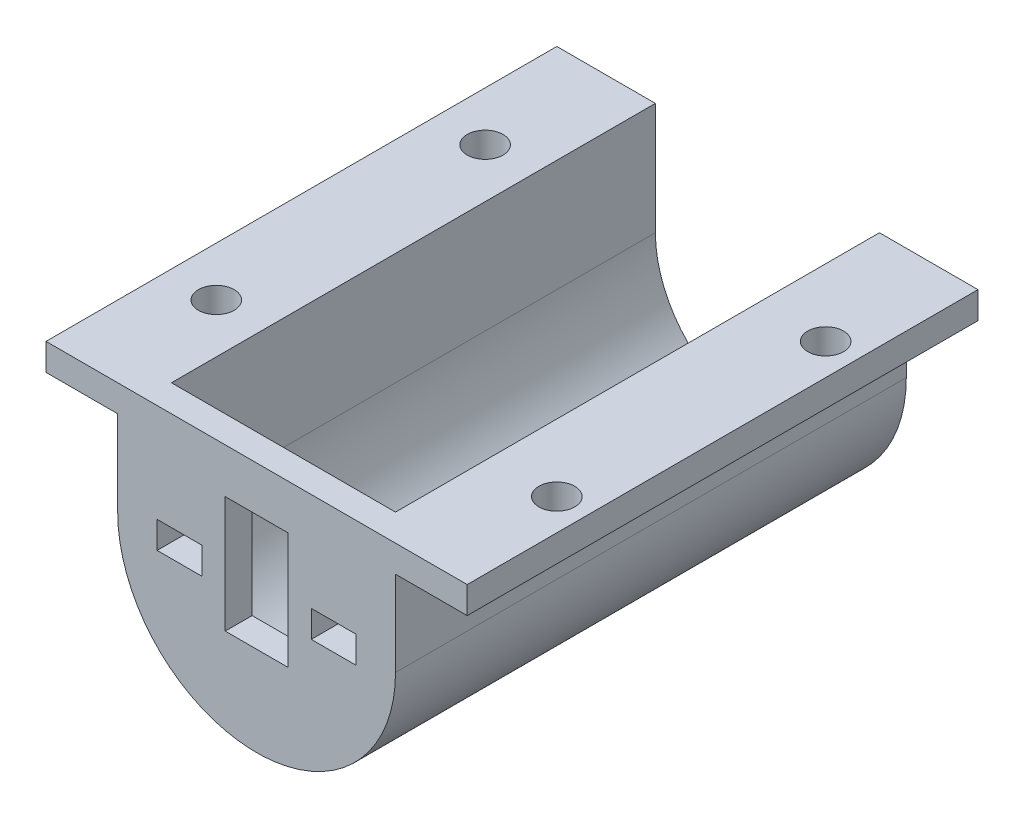
ISO-10303-21;
HEADER;
FILE_DESCRIPTION(('STEP AP214'),'2;1');
FILE_NAME('part.step','',(''),(''),'','','');
FILE_SCHEMA(('AUTOMOTIVE_DESIGN { 1 0 10303 214 1 1 1 1 }'));
ENDSEC;
DATA;
#1=APPLICATION_CONTEXT('core data for automotive mechanical design processes');
#2=APPLICATION_PROTOCOL_DEFINITION('international standard','automotive_design',2000,#1);
#3=PRODUCT_CONTEXT('',#1,'mechanical');
#4=PRODUCT('Part','Part','',(#3));
#5=PRODUCT_RELATED_PRODUCT_CATEGORY('part','',(#4));
#6=PRODUCT_DEFINITION_FORMATION('','',#4);
#7=PRODUCT_DEFINITION_CONTEXT('part definition',#1,'design');
#8=PRODUCT_DEFINITION('design','',#6,#7);
#9=PRODUCT_DEFINITION_SHAPE('','',#8);
#10=(LENGTH_UNIT() NAMED_UNIT(*) SI_UNIT(.MILLI.,.METRE.));
#11=(NAMED_UNIT(*) PLANE_ANGLE_UNIT() SI_UNIT($,.RADIAN.));
#12=(NAMED_UNIT(*) SI_UNIT($,.STERADIAN.) SOLID_ANGLE_UNIT());
#13=UNCERTAINTY_MEASURE_WITH_UNIT(LENGTH_MEASURE(1.E-05),#10,'distance_accuracy_value','');
#14=(GEOMETRIC_REPRESENTATION_CONTEXT(3) GLOBAL_UNCERTAINTY_ASSIGNED_CONTEXT((#13)) GLOBAL_UNIT_ASSIGNED_CONTEXT((#10,
#11,#12)) REPRESENTATION_CONTEXT('',''));
#15=CARTESIAN_POINT('',(0.,0.,0.));
#16=DIRECTION('',(0.,0.,1.));
#17=DIRECTION('',(1.,0.,0.));
#18=AXIS2_PLACEMENT_3D('',#15,#16,#17);
#19=CARTESIAN_POINT('',(0.,0.,28.5));
#20=DIRECTION('',(0.,0.,-1.));
#21=DIRECTION('',(-1.,0.,0.));
#22=AXIS2_PLACEMENT_3D('',#19,#20,#21);
#23=CYLINDRICAL_SURFACE('',#22,12.5);
#24=CARTESIAN_POINT('',(0.,0.,25.5));
#25=DIRECTION('',(0.,0.,1.));
#26=DIRECTION('',(1.,0.,0.));
#27=AXIS2_PLACEMENT_3D('',#24,#25,#26);
#28=CIRCLE('',#27,12.5);
#29=CARTESIAN_POINT('',(12.5,0.,25.5));
#30=VERTEX_POINT('',#29);
#31=CARTESIAN_POINT('',(-12.5,0.,25.5));
#32=VERTEX_POINT('',#31);
#33=EDGE_CURVE('E340',#30,#32,#28,.F.);
#34=ORIENTED_EDGE('',*,*,#33,.F.);
#35=DIRECTION('',(0.,0.,-1.));
#36=VECTOR('',#35,1.);
#37=CARTESIAN_POINT('',(12.5,0.,28.5));
#38=LINE('',#37,#36);
#39=CARTESIAN_POINT('',(12.5,0.,-28.5));
#40=VERTEX_POINT('',#39);
#41=EDGE_CURVE('E399',#30,#40,#38,.T.);
#42=ORIENTED_EDGE('',*,*,#41,.T.);
#43=CARTESIAN_POINT('',(0.,0.,-28.5));
#44=DIRECTION('',(0.,0.,-1.));
#45=DIRECTION('',(1.,0.,0.));
#46=AXIS2_PLACEMENT_3D('',#43,#44,#45);
#47=CIRCLE('',#46,12.5);
#48=CARTESIAN_POINT('',(-12.5,0.,-28.5));
#49=VERTEX_POINT('',#48);
#50=EDGE_CURVE('E372',#40,#49,#47,.T.);
#51=ORIENTED_EDGE('',*,*,#50,.T.);
#52=DIRECTION('',(0.,0.,-1.));
#53=VECTOR('',#52,1.);
#54=CARTESIAN_POINT('',(-12.5,0.,28.5));
#55=LINE('',#54,#53);
#56=EDGE_CURVE('E47',#32,#49,#55,.T.);
#57=ORIENTED_EDGE('',*,*,#56,.F.);
#58=EDGE_LOOP('',(#34,#42,#51,#57));
#59=FACE_BOUND('',#58,.T.);
#60=ADVANCED_FACE('F39',(#59),#23,.F.);
#61=CARTESIAN_POINT('',(-12.5,0.,28.5));
#62=DIRECTION('',(-1.,0.,0.));
#63=DIRECTION('',(0.,-1.,0.));
#64=AXIS2_PLACEMENT_3D('',#61,#62,#63);
#65=PLANE('',#64);
#66=DIRECTION('',(0.,1.,0.));
#67=VECTOR('',#66,1.);
#68=CARTESIAN_POINT('',(-12.5,0.,25.5));
#69=LINE('',#68,#67);
#70=CARTESIAN_POINT('',(-12.5,12.5,25.5));
#71=VERTEX_POINT('',#70);
#72=EDGE_CURVE('E343',#32,#71,#69,.T.);
#73=ORIENTED_EDGE('',*,*,#72,.F.);
#74=ORIENTED_EDGE('',*,*,#56,.T.);
#75=DIRECTION('',(0.,1.,0.));
#76=VECTOR('',#75,1.);
#77=CARTESIAN_POINT('',(-12.5,0.,-28.5));
#78=LINE('',#77,#76);
#79=CARTESIAN_POINT('',(-12.5,12.5,-28.5));
#80=VERTEX_POINT('',#79);
#81=EDGE_CURVE('E403',#49,#80,#78,.T.);
#82=ORIENTED_EDGE('',*,*,#81,.T.);
#83=DIRECTION('',(0.,0.,-1.));
#84=VECTOR('',#83,1.);
#85=CARTESIAN_POINT('',(-12.5,12.5,28.5));
#86=LINE('',#85,#84);
#87=EDGE_CURVE('E475',#71,#80,#86,.T.);
#88=ORIENTED_EDGE('',*,*,#87,.F.);
#89=EDGE_LOOP('',(#73,#74,#82,#88));
#90=FACE_BOUND('',#89,.T.);
#91=ADVANCED_FACE('F507',(#90),#65,.F.);
#92=CARTESIAN_POINT('',(12.5,0.,28.5));
#93=DIRECTION('',(1.,0.,0.));
#94=DIRECTION('',(0.,1.,0.));
#95=AXIS2_PLACEMENT_3D('',#92,#93,#94);
#96=PLANE('',#95);
#97=DIRECTION('',(0.,-1.,0.));
#98=VECTOR('',#97,1.);
#99=CARTESIAN_POINT('',(12.5,0.,25.5));
#100=LINE('',#99,#98);
#101=CARTESIAN_POINT('',(12.5,12.5,25.5));
#102=VERTEX_POINT('',#101);
#103=EDGE_CURVE('E11',#102,#30,#100,.T.);
#104=ORIENTED_EDGE('',*,*,#103,.F.);
#105=DIRECTION('',(0.,0.,-1.));
#106=VECTOR('',#105,1.);
#107=CARTESIAN_POINT('',(12.5,12.5,28.5));
#108=LINE('',#107,#106);
#109=CARTESIAN_POINT('',(12.5,12.5,-28.5));
#110=VERTEX_POINT('',#109);
#111=EDGE_CURVE('E444',#102,#110,#108,.T.);
#112=ORIENTED_EDGE('',*,*,#111,.T.);
#113=DIRECTION('',(0.,-1.,0.));
#114=VECTOR('',#113,1.);
#115=CARTESIAN_POINT('',(12.5,0.,-28.5));
#116=LINE('',#115,#114);
#117=EDGE_CURVE('E377',#110,#40,#116,.T.);
#118=ORIENTED_EDGE('',*,*,#117,.T.);
#119=ORIENTED_EDGE('',*,*,#41,.F.);
#120=EDGE_LOOP('',(#104,#112,#118,#119));
#121=FACE_BOUND('',#120,.T.);
#122=ADVANCED_FACE('F512',(#121),#96,.F.);
#123=CARTESIAN_POINT('',(-23.5,12.5,28.5));
#124=DIRECTION('',(1.,0.,0.));
#125=DIRECTION('',(0.,0.,-1.));
#126=AXIS2_PLACEMENT_3D('',#123,#124,#125);
#127=PLANE('',#126);
#128=DIRECTION('',(0.,-1.,0.));
#129=VECTOR('',#128,1.);
#130=CARTESIAN_POINT('',(-23.5,12.5,-28.5));
#131=LINE('',#130,#129);
#132=CARTESIAN_POINT('',(-23.5,12.5,-28.5));
#133=VERTEX_POINT('',#132);
#134=CARTESIAN_POINT('',(-23.5,9.5,-28.5));
#135=VERTEX_POINT('',#134);
#136=EDGE_CURVE('E410',#133,#135,#131,.T.);
#137=ORIENTED_EDGE('',*,*,#136,.T.);
#138=DIRECTION('',(0.,0.,-1.));
#139=VECTOR('',#138,1.);
#140=CARTESIAN_POINT('',(-23.5,9.5,28.5));
#141=LINE('',#140,#139);
#142=CARTESIAN_POINT('',(-23.5,9.5,28.5));
#143=VERTEX_POINT('',#142);
#144=EDGE_CURVE('E467',#143,#135,#141,.T.);
#145=ORIENTED_EDGE('',*,*,#144,.F.);
#146=DIRECTION('',(0.,-1.,0.));
#147=VECTOR('',#146,1.);
#148=CARTESIAN_POINT('',(-23.5,12.5,28.5));
#149=LINE('',#148,#147);
#150=CARTESIAN_POINT('',(-23.5,12.5,28.5));
#151=VERTEX_POINT('',#150);
#152=EDGE_CURVE('E376',#151,#143,#149,.T.);
#153=ORIENTED_EDGE('',*,*,#152,.F.);
#154=DIRECTION('',(0.,0.,-1.));
#155=VECTOR('',#154,1.);
#156=CARTESIAN_POINT('',(-23.5,12.5,28.5));
#157=LINE('',#156,#155);
#158=EDGE_CURVE('E471',#151,#133,#157,.T.);
#159=ORIENTED_EDGE('',*,*,#158,.T.);
#160=EDGE_LOOP('',(#137,#145,#153,#159));
#161=FACE_BOUND('',#160,.T.);
#162=ADVANCED_FACE('F563',(#161),#127,.F.);
#163=CARTESIAN_POINT('',(-23.5,9.5,28.5));
#164=DIRECTION('',(0.,1.,0.));
#165=DIRECTION('',(0.,0.,1.));
#166=AXIS2_PLACEMENT_3D('',#163,#164,#165);
#167=PLANE('',#166);
#168=CARTESIAN_POINT('',(-18.,9.50000000000001,-15.));
#169=DIRECTION('',(0.,-1.,0.));
#170=DIRECTION('',(1.,0.,0.));
#171=AXIS2_PLACEMENT_3D('',#168,#169,#170);
#172=CIRCLE('',#171,2.);
#173=CARTESIAN_POINT('',(-16.,9.50000000000001,-15.));
#174=VERTEX_POINT('',#173);
#175=EDGE_CURVE('E351',#174,#174,#172,.T.);
#176=ORIENTED_EDGE('',*,*,#175,.F.);
#177=EDGE_LOOP('',(#176));
#178=FACE_BOUND('',#177,.T.);
#179=CARTESIAN_POINT('',(-18.,9.50000000000001,15.));
#180=DIRECTION('',(0.,-1.,0.));
#181=DIRECTION('',(1.,0.,0.));
#182=AXIS2_PLACEMENT_3D('',#179,#180,#181);
#183=CIRCLE('',#182,2.);
#184=CARTESIAN_POINT('',(-16.,9.50000000000001,15.));
#185=VERTEX_POINT('',#184);
#186=EDGE_CURVE('E355',#185,#185,#183,.T.);
#187=ORIENTED_EDGE('',*,*,#186,.F.);
#188=EDGE_LOOP('',(#187));
#189=FACE_BOUND('',#188,.T.);
#190=DIRECTION('',(1.,0.,0.));
#191=VECTOR('',#190,1.);
#192=CARTESIAN_POINT('',(-23.5,9.5,-28.5));
#193=LINE('',#192,#191);
#194=CARTESIAN_POINT('',(-15.5,9.5,-28.5));
#195=VERTEX_POINT('',#194);
#196=EDGE_CURVE('E413',#135,#195,#193,.T.);
#197=ORIENTED_EDGE('',*,*,#196,.T.);
#198=DIRECTION('',(0.,0.,-1.));
#199=VECTOR('',#198,1.);
#200=CARTESIAN_POINT('',(-15.5,9.5,28.5));
#201=LINE('',#200,#199);
#202=CARTESIAN_POINT('',(-15.5,9.5,28.5));
#203=VERTEX_POINT('',#202);
#204=EDGE_CURVE('E464',#203,#195,#201,.T.);
#205=ORIENTED_EDGE('',*,*,#204,.F.);
#206=DIRECTION('',(1.,0.,0.));
#207=VECTOR('',#206,1.);
#208=CARTESIAN_POINT('',(-23.5,9.5,28.5));
#209=LINE('',#208,#207);
#210=EDGE_CURVE('E380',#143,#203,#209,.T.);
#211=ORIENTED_EDGE('',*,*,#210,.F.);
#212=ORIENTED_EDGE('',*,*,#144,.T.);
#213=EDGE_LOOP('',(#197,#205,#211,#212));
#214=FACE_BOUND('',#213,.T.);
#215=ADVANCED_FACE('F560',(#178,#189,#214),#167,.F.);
#216=CARTESIAN_POINT('',(-15.5,9.5,28.5));
#217=DIRECTION('',(1.,0.,0.));
#218=DIRECTION('',(0.,0.,-1.));
#219=AXIS2_PLACEMENT_3D('',#216,#217,#218);
#220=PLANE('',#219);
#221=ORIENTED_EDGE('',*,*,#204,.T.);
#222=DIRECTION('',(0.,-1.,0.));
#223=VECTOR('',#222,1.);
#224=CARTESIAN_POINT('',(-15.5,9.5,-28.5));
#225=LINE('',#224,#223);
#226=CARTESIAN_POINT('',(-15.5,0.,-28.5));
#227=VERTEX_POINT('',#226);
#228=EDGE_CURVE('E417',#195,#227,#225,.T.);
#229=ORIENTED_EDGE('',*,*,#228,.T.);
#230=DIRECTION('',(0.,0.,-1.));
#231=VECTOR('',#230,1.);
#232=CARTESIAN_POINT('',(-15.5,0.,28.5));
#233=LINE('',#232,#231);
#234=CARTESIAN_POINT('',(-15.5,0.,28.5));
#235=VERTEX_POINT('',#234);
#236=EDGE_CURVE('E461',#235,#227,#233,.T.);
#237=ORIENTED_EDGE('',*,*,#236,.F.);
#238=DIRECTION('',(0.,-1.,0.));
#239=VECTOR('',#238,1.);
#240=CARTESIAN_POINT('',(-15.5,9.5,28.5));
#241=LINE('',#240,#239);
#242=EDGE_CURVE('E383',#203,#235,#241,.T.);
#243=ORIENTED_EDGE('',*,*,#242,.F.);
#244=EDGE_LOOP('',(#221,#229,#237,#243));
#245=FACE_BOUND('',#244,.T.);
#246=ADVANCED_FACE('F556',(#245),#220,.F.);
#247=CARTESIAN_POINT('',(0.,0.,28.5));
#248=DIRECTION('',(0.,0.,-1.));
#249=DIRECTION('',(-1.,0.,0.));
#250=AXIS2_PLACEMENT_3D('',#247,#248,#249);
#251=CYLINDRICAL_SURFACE('',#250,15.5);
#252=ORIENTED_EDGE('',*,*,#236,.T.);
#253=CARTESIAN_POINT('',(0.,0.,-28.5));
#254=DIRECTION('',(0.,0.,1.));
#255=DIRECTION('',(1.,0.,0.));
#256=AXIS2_PLACEMENT_3D('',#253,#254,#255);
#257=CIRCLE('',#256,15.5);
#258=CARTESIAN_POINT('',(15.5,0.,-28.5));
#259=VERTEX_POINT('',#258);
#260=EDGE_CURVE('E421',#227,#259,#257,.T.);
#261=ORIENTED_EDGE('',*,*,#260,.T.);
#262=DIRECTION('',(0.,0.,-1.));
#263=VECTOR('',#262,1.);
#264=CARTESIAN_POINT('',(15.5,0.,28.5));
#265=LINE('',#264,#263);
#266=CARTESIAN_POINT('',(15.5,0.,28.5));
#267=VERTEX_POINT('',#266);
#268=EDGE_CURVE('E458',#267,#259,#265,.T.);
#269=ORIENTED_EDGE('',*,*,#268,.F.);
#270=CARTESIAN_POINT('',(0.,0.,28.5));
#271=DIRECTION('',(0.,0.,1.));
#272=DIRECTION('',(1.,0.,0.));
#273=AXIS2_PLACEMENT_3D('',#270,#271,#272);
#274=CIRCLE('',#273,15.5);
#275=EDGE_CURVE('E386',#235,#267,#274,.T.);
#276=ORIENTED_EDGE('',*,*,#275,.F.);
#277=EDGE_LOOP('',(#252,#261,#269,#276));
#278=FACE_BOUND('',#277,.T.);
#279=ADVANCED_FACE('F551',(#278),#251,.T.);
#280=CARTESIAN_POINT('',(15.5,9.5,28.5));
#281=DIRECTION('',(-1.,0.,0.));
#282=DIRECTION('',(0.,-1.,0.));
#283=AXIS2_PLACEMENT_3D('',#280,#281,#282);
#284=PLANE('',#283);
#285=ORIENTED_EDGE('',*,*,#268,.T.);
#286=DIRECTION('',(0.,1.,0.));
#287=VECTOR('',#286,1.);
#288=CARTESIAN_POINT('',(15.5,9.5,-28.5));
#289=LINE('',#288,#287);
#290=CARTESIAN_POINT('',(15.5,9.5,-28.5));
#291=VERTEX_POINT('',#290);
#292=EDGE_CURVE('E425',#259,#291,#289,.T.);
#293=ORIENTED_EDGE('',*,*,#292,.T.);
#294=DIRECTION('',(0.,0.,-1.));
#295=VECTOR('',#294,1.);
#296=CARTESIAN_POINT('',(15.5,9.5,28.5));
#297=LINE('',#296,#295);
#298=CARTESIAN_POINT('',(15.5,9.5,28.5));
#299=VERTEX_POINT('',#298);
#300=EDGE_CURVE('E455',#299,#291,#297,.T.);
#301=ORIENTED_EDGE('',*,*,#300,.F.);
#302=DIRECTION('',(0.,1.,0.));
#303=VECTOR('',#302,1.);
#304=CARTESIAN_POINT('',(15.5,9.5,28.5));
#305=LINE('',#304,#303);
#306=EDGE_CURVE('E389',#267,#299,#305,.T.);
#307=ORIENTED_EDGE('',*,*,#306,.F.);
#308=EDGE_LOOP('',(#285,#293,#301,#307));
#309=FACE_BOUND('',#308,.T.);
#310=ADVANCED_FACE('F545',(#309),#284,.F.);
#311=CARTESIAN_POINT('',(23.5,9.5,28.5));
#312=DIRECTION('',(0.,1.,0.));
#313=DIRECTION('',(-1.,0.,0.));
#314=AXIS2_PLACEMENT_3D('',#311,#312,#313);
#315=PLANE('',#314);
#316=CARTESIAN_POINT('',(20.,9.50000000000002,15.));
#317=DIRECTION('',(0.,-1.,0.));
#318=DIRECTION('',(1.,0.,0.));
#319=AXIS2_PLACEMENT_3D('',#316,#317,#318);
#320=CIRCLE('',#319,2.);
#321=CARTESIAN_POINT('',(22.,9.50000000000002,15.));
#322=VERTEX_POINT('',#321);
#323=EDGE_CURVE('E350',#322,#322,#320,.T.);
#324=ORIENTED_EDGE('',*,*,#323,.F.);
#325=EDGE_LOOP('',(#324));
#326=FACE_BOUND('',#325,.T.);
#327=CARTESIAN_POINT('',(20.,9.50000000000002,-15.));
#328=DIRECTION('',(0.,-1.,0.));
#329=DIRECTION('',(1.,0.,0.));
#330=AXIS2_PLACEMENT_3D('',#327,#328,#329);
#331=CIRCLE('',#330,2.);
#332=CARTESIAN_POINT('',(22.,9.50000000000002,-15.));
#333=VERTEX_POINT('',#332);
#334=EDGE_CURVE('E346',#333,#333,#331,.T.);
#335=ORIENTED_EDGE('',*,*,#334,.F.);
#336=EDGE_LOOP('',(#335));
#337=FACE_BOUND('',#336,.T.);
#338=DIRECTION('',(1.,0.,0.));
#339=VECTOR('',#338,1.);
#340=CARTESIAN_POINT('',(23.5,9.5,-28.5));
#341=LINE('',#340,#339);
#342=CARTESIAN_POINT('',(23.5,9.5,-28.5));
#343=VERTEX_POINT('',#342);
#344=EDGE_CURVE('E429',#291,#343,#341,.T.);
#345=ORIENTED_EDGE('',*,*,#344,.T.);
#346=DIRECTION('',(0.,0.,-1.));
#347=VECTOR('',#346,1.);
#348=CARTESIAN_POINT('',(23.5,9.5,28.5));
#349=LINE('',#348,#347);
#350=CARTESIAN_POINT('',(23.5,9.5,28.5));
#351=VERTEX_POINT('',#350);
#352=EDGE_CURVE('E451',#351,#343,#349,.T.);
#353=ORIENTED_EDGE('',*,*,#352,.F.);
#354=DIRECTION('',(1.,0.,0.));
#355=VECTOR('',#354,1.);
#356=CARTESIAN_POINT('',(23.5,9.5,28.5));
#357=LINE('',#356,#355);
#358=EDGE_CURVE('E392',#299,#351,#357,.T.);
#359=ORIENTED_EDGE('',*,*,#358,.F.);
#360=ORIENTED_EDGE('',*,*,#300,.T.);
#361=EDGE_LOOP('',(#345,#353,#359,#360));
#362=FACE_BOUND('',#361,.T.);
#363=ADVANCED_FACE('F541',(#326,#337,#362),#315,.F.);
#364=CARTESIAN_POINT('',(23.5,12.5,28.5));
#365=DIRECTION('',(-1.,0.,0.));
#366=DIRECTION('',(0.,0.,1.));
#367=AXIS2_PLACEMENT_3D('',#364,#365,#366);
#368=PLANE('',#367);
#369=DIRECTION('',(0.,1.,0.));
#370=VECTOR('',#369,1.);
#371=CARTESIAN_POINT('',(23.5,12.5,-28.5));
#372=LINE('',#371,#370);
#373=CARTESIAN_POINT('',(23.5,12.5,-28.5));
#374=VERTEX_POINT('',#373);
#375=EDGE_CURVE('E432',#343,#374,#372,.T.);
#376=ORIENTED_EDGE('',*,*,#375,.T.);
#377=DIRECTION('',(0.,0.,-1.));
#378=VECTOR('',#377,1.);
#379=CARTESIAN_POINT('',(23.5,12.5,28.5));
#380=LINE('',#379,#378);
#381=CARTESIAN_POINT('',(23.5,12.5,28.5));
#382=VERTEX_POINT('',#381);
#383=EDGE_CURVE('E447',#382,#374,#380,.T.);
#384=ORIENTED_EDGE('',*,*,#383,.F.);
#385=DIRECTION('',(0.,1.,0.));
#386=VECTOR('',#385,1.);
#387=CARTESIAN_POINT('',(23.5,12.5,28.5));
#388=LINE('',#387,#386);
#389=EDGE_CURVE('E395',#351,#382,#388,.T.);
#390=ORIENTED_EDGE('',*,*,#389,.F.);
#391=ORIENTED_EDGE('',*,*,#352,.T.);
#392=EDGE_LOOP('',(#376,#384,#390,#391));
#393=FACE_BOUND('',#392,.T.);
#394=ADVANCED_FACE('F536',(#393),#368,.F.);
#395=CARTESIAN_POINT('',(12.5,12.5,28.5));
#396=DIRECTION('',(0.,-1.,0.));
#397=DIRECTION('',(0.,0.,-1.));
#398=AXIS2_PLACEMENT_3D('',#395,#396,#397);
#399=PLANE('',#398);
#400=DIRECTION('',(-1.,0.,0.));
#401=VECTOR('',#400,1.);
#402=CARTESIAN_POINT('',(-12.5,12.5,28.5));
#403=LINE('',#402,#401);
#404=EDGE_CURVE('E373',#382,#151,#403,.T.);
#405=ORIENTED_EDGE('',*,*,#404,.F.);
#406=ORIENTED_EDGE('',*,*,#383,.T.);
#407=DIRECTION('',(-1.,0.,0.));
#408=VECTOR('',#407,1.);
#409=CARTESIAN_POINT('',(12.5,12.5,-28.5));
#410=LINE('',#409,#408);
#411=EDGE_CURVE('E435',#374,#110,#410,.T.);
#412=ORIENTED_EDGE('',*,*,#411,.T.);
#413=ORIENTED_EDGE('',*,*,#111,.F.);
#414=DIRECTION('',(-1.,0.,0.));
#415=VECTOR('',#414,1.);
#416=CARTESIAN_POINT('',(-15.5,12.5,25.5));
#417=LINE('',#416,#415);
#418=EDGE_CURVE('E246',#102,#71,#417,.T.);
#419=ORIENTED_EDGE('',*,*,#418,.T.);
#420=ORIENTED_EDGE('',*,*,#87,.T.);
#421=DIRECTION('',(-1.,0.,0.));
#422=VECTOR('',#421,1.);
#423=CARTESIAN_POINT('',(-12.5,12.5,-28.5));
#424=LINE('',#423,#422);
#425=EDGE_CURVE('E407',#80,#133,#424,.T.);
#426=ORIENTED_EDGE('',*,*,#425,.T.);
#427=ORIENTED_EDGE('',*,*,#158,.F.);
#428=EDGE_LOOP('',(#405,#406,#412,#413,#419,#420,#426,#427));
#429=FACE_BOUND('',#428,.T.);
#430=CARTESIAN_POINT('',(20.,12.5,15.));
#431=DIRECTION('',(0.,-1.,0.));
#432=DIRECTION('',(0.,0.,-1.));
#433=AXIS2_PLACEMENT_3D('',#430,#431,#432);
#434=CIRCLE('',#433,2.);
#435=CARTESIAN_POINT('',(20.,12.5,13.));
#436=VERTEX_POINT('',#435);
#437=EDGE_CURVE('E368',#436,#436,#434,.T.);
#438=ORIENTED_EDGE('',*,*,#437,.T.);
#439=EDGE_LOOP('',(#438));
#440=FACE_BOUND('',#439,.T.);
#441=CARTESIAN_POINT('',(20.,12.5,-15.));
#442=DIRECTION('',(0.,-1.,0.));
#443=DIRECTION('',(0.,0.,-1.));
#444=AXIS2_PLACEMENT_3D('',#441,#442,#443);
#445=CIRCLE('',#444,2.);
#446=CARTESIAN_POINT('',(20.,12.5,-17.));
#447=VERTEX_POINT('',#446);
#448=EDGE_CURVE('E362',#447,#447,#445,.T.);
#449=ORIENTED_EDGE('',*,*,#448,.T.);
#450=EDGE_LOOP('',(#449));
#451=FACE_BOUND('',#450,.T.);
#452=CARTESIAN_POINT('',(-18.,12.5,-15.));
#453=DIRECTION('',(0.,-1.,0.));
#454=DIRECTION('',(1.,0.,0.));
#455=AXIS2_PLACEMENT_3D('',#452,#453,#454);
#456=CIRCLE('',#455,2.);
#457=CARTESIAN_POINT('',(-16.,12.5,-15.));
#458=VERTEX_POINT('',#457);
#459=EDGE_CURVE('E367',#458,#458,#456,.T.);
#460=ORIENTED_EDGE('',*,*,#459,.T.);
#461=EDGE_LOOP('',(#460));
#462=FACE_BOUND('',#461,.T.);
#463=CARTESIAN_POINT('',(-18.,12.5,15.));
#464=DIRECTION('',(0.,-1.,0.));
#465=DIRECTION('',(1.,0.,0.));
#466=AXIS2_PLACEMENT_3D('',#463,#464,#465);
#467=CIRCLE('',#466,2.);
#468=CARTESIAN_POINT('',(-16.,12.5,15.));
#469=VERTEX_POINT('',#468);
#470=EDGE_CURVE('E363',#469,#469,#467,.T.);
#471=ORIENTED_EDGE('',*,*,#470,.T.);
#472=EDGE_LOOP('',(#471));
#473=FACE_BOUND('',#472,.T.);
#474=ADVANCED_FACE('F486',(#429,#440,#451,#462,#473),#399,.F.);
#475=CARTESIAN_POINT('',(0.,0.,28.5));
#476=DIRECTION('',(0.,0.,1.));
#477=DIRECTION('',(1.,0.,0.));
#478=AXIS2_PLACEMENT_3D('',#475,#476,#477);
#479=PLANE('',#478);
#480=DIRECTION('',(0.,1.,0.));
#481=VECTOR('',#480,1.);
#482=CARTESIAN_POINT('',(11.1,1.5,28.5));
#483=LINE('',#482,#481);
#484=CARTESIAN_POINT('',(11.1,-1.5,28.5));
#485=VERTEX_POINT('',#484);
#486=CARTESIAN_POINT('',(11.1,1.5,28.5));
#487=VERTEX_POINT('',#486);
#488=EDGE_CURVE('E54',#485,#487,#483,.T.);
#489=ORIENTED_EDGE('',*,*,#488,.F.);
#490=DIRECTION('',(1.,0.,0.));
#491=VECTOR('',#490,1.);
#492=CARTESIAN_POINT('',(11.1,-1.5,28.5));
#493=LINE('',#492,#491);
#494=CARTESIAN_POINT('',(6.1,-1.5,28.5));
#495=VERTEX_POINT('',#494);
#496=EDGE_CURVE('E223',#495,#485,#493,.T.);
#497=ORIENTED_EDGE('',*,*,#496,.F.);
#498=DIRECTION('',(0.,-1.,0.));
#499=VECTOR('',#498,1.);
#500=CARTESIAN_POINT('',(6.1,1.5,28.5));
#501=LINE('',#500,#499);
#502=CARTESIAN_POINT('',(6.1,1.5,28.5));
#503=VERTEX_POINT('',#502);
#504=EDGE_CURVE('E227',#503,#495,#501,.T.);
#505=ORIENTED_EDGE('',*,*,#504,.F.);
#506=DIRECTION('',(-1.,0.,0.));
#507=VECTOR('',#506,1.);
#508=CARTESIAN_POINT('',(11.1,1.5,28.5));
#509=LINE('',#508,#507);
#510=EDGE_CURVE('E236',#487,#503,#509,.T.);
#511=ORIENTED_EDGE('',*,*,#510,.F.);
#512=EDGE_LOOP('',(#489,#497,#505,#511));
#513=FACE_BOUND('',#512,.T.);
#514=DIRECTION('',(0.,-1.,0.));
#515=VECTOR('',#514,1.);
#516=CARTESIAN_POINT('',(-11.1,1.5,28.5));
#517=LINE('',#516,#515);
#518=CARTESIAN_POINT('',(-11.1,1.5,28.5));
#519=VERTEX_POINT('',#518);
#520=CARTESIAN_POINT('',(-11.1,-1.5,28.5));
#521=VERTEX_POINT('',#520);
#522=EDGE_CURVE('E62',#519,#521,#517,.T.);
#523=ORIENTED_EDGE('',*,*,#522,.F.);
#524=DIRECTION('',(-1.,0.,0.));
#525=VECTOR('',#524,1.);
#526=CARTESIAN_POINT('',(-11.1,1.5,28.5));
#527=LINE('',#526,#525);
#528=CARTESIAN_POINT('',(-6.1,1.5,28.5));
#529=VERTEX_POINT('',#528);
#530=EDGE_CURVE('E257',#529,#519,#527,.T.);
#531=ORIENTED_EDGE('',*,*,#530,.F.);
#532=DIRECTION('',(0.,1.,0.));
#533=VECTOR('',#532,1.);
#534=CARTESIAN_POINT('',(-6.1,1.5,28.5));
#535=LINE('',#534,#533);
#536=CARTESIAN_POINT('',(-6.1,-1.5,28.5));
#537=VERTEX_POINT('',#536);
#538=EDGE_CURVE('E277',#537,#529,#535,.T.);
#539=ORIENTED_EDGE('',*,*,#538,.F.);
#540=DIRECTION('',(1.,0.,0.));
#541=VECTOR('',#540,1.);
#542=CARTESIAN_POINT('',(-11.1,-1.5,28.5));
#543=LINE('',#542,#541);
#544=EDGE_CURVE('E272',#521,#537,#543,.T.);
#545=ORIENTED_EDGE('',*,*,#544,.F.);
#546=EDGE_LOOP('',(#523,#531,#539,#545));
#547=FACE_BOUND('',#546,.T.);
#548=DIRECTION('',(0.,-1.,0.));
#549=VECTOR('',#548,1.);
#550=CARTESIAN_POINT('',(-3.5,-5.5,28.5));
#551=LINE('',#550,#549);
#552=CARTESIAN_POINT('',(-3.5,7.5,28.5));
#553=VERTEX_POINT('',#552);
#554=CARTESIAN_POINT('',(-3.5,-5.5,28.5));
#555=VERTEX_POINT('',#554);
#556=EDGE_CURVE('E312',#553,#555,#551,.T.);
#557=ORIENTED_EDGE('',*,*,#556,.F.);
#558=DIRECTION('',(-1.,0.,0.));
#559=VECTOR('',#558,1.);
#560=CARTESIAN_POINT('',(-3.5,7.5,28.5));
#561=LINE('',#560,#559);
#562=CARTESIAN_POINT('',(3.5,7.5,28.5));
#563=VERTEX_POINT('',#562);
#564=EDGE_CURVE('E299',#563,#553,#561,.T.);
#565=ORIENTED_EDGE('',*,*,#564,.F.);
#566=DIRECTION('',(0.,1.,0.));
#567=VECTOR('',#566,1.);
#568=CARTESIAN_POINT('',(3.5,-5.5,28.5));
#569=LINE('',#568,#567);
#570=CARTESIAN_POINT('',(3.5,-5.5,28.5));
#571=VERTEX_POINT('',#570);
#572=EDGE_CURVE('E319',#571,#563,#569,.T.);
#573=ORIENTED_EDGE('',*,*,#572,.F.);
#574=DIRECTION('',(1.,0.,0.));
#575=VECTOR('',#574,1.);
#576=CARTESIAN_POINT('',(3.5,-5.5,28.5));
#577=LINE('',#576,#575);
#578=EDGE_CURVE('E315',#555,#571,#577,.T.);
#579=ORIENTED_EDGE('',*,*,#578,.F.);
#580=EDGE_LOOP('',(#557,#565,#573,#579));
#581=FACE_BOUND('',#580,.T.);
#582=ORIENTED_EDGE('',*,*,#389,.T.);
#583=ORIENTED_EDGE('',*,*,#404,.T.);
#584=ORIENTED_EDGE('',*,*,#152,.T.);
#585=ORIENTED_EDGE('',*,*,#210,.T.);
#586=ORIENTED_EDGE('',*,*,#242,.T.);
#587=ORIENTED_EDGE('',*,*,#275,.T.);
#588=ORIENTED_EDGE('',*,*,#306,.T.);
#589=ORIENTED_EDGE('',*,*,#358,.T.);
#590=EDGE_LOOP('',(#582,#583,#584,#585,#586,#587,#588,#589));
#591=FACE_BOUND('',#590,.T.);
#592=ADVANCED_FACE('F567',(#513,#547,#581,#591),#479,.T.);
#593=CARTESIAN_POINT('',(0.,0.,-28.5));
#594=DIRECTION('',(0.,0.,1.));
#595=DIRECTION('',(1.,0.,0.));
#596=AXIS2_PLACEMENT_3D('',#593,#594,#595);
#597=PLANE('',#596);
#598=ORIENTED_EDGE('',*,*,#50,.F.);
#599=ORIENTED_EDGE('',*,*,#117,.F.);
#600=ORIENTED_EDGE('',*,*,#411,.F.);
#601=ORIENTED_EDGE('',*,*,#375,.F.);
#602=ORIENTED_EDGE('',*,*,#344,.F.);
#603=ORIENTED_EDGE('',*,*,#292,.F.);
#604=ORIENTED_EDGE('',*,*,#260,.F.);
#605=ORIENTED_EDGE('',*,*,#228,.F.);
#606=ORIENTED_EDGE('',*,*,#196,.F.);
#607=ORIENTED_EDGE('',*,*,#136,.F.);
#608=ORIENTED_EDGE('',*,*,#425,.F.);
#609=ORIENTED_EDGE('',*,*,#81,.F.);
#610=EDGE_LOOP('',(#598,#599,#600,#601,#602,#603,#604,#605,#606,#607,#608,#609));
#611=FACE_BOUND('',#610,.T.);
#612=ADVANCED_FACE('F502',(#611),#597,.F.);
#613=CARTESIAN_POINT('',(20.,14.5,-15.));
#614=DIRECTION('',(0.,-1.,0.));
#615=DIRECTION('',(1.,0.,0.));
#616=AXIS2_PLACEMENT_3D('',#613,#614,#615);
#617=CYLINDRICAL_SURFACE('',#616,2.);
#618=ORIENTED_EDGE('',*,*,#334,.T.);
#619=EDGE_LOOP('',(#618));
#620=FACE_BOUND('',#619,.T.);
#621=ORIENTED_EDGE('',*,*,#448,.F.);
#622=EDGE_LOOP('',(#621));
#623=FACE_BOUND('',#622,.T.);
#624=ADVANCED_FACE('F492',(#620,#623),#617,.F.);
#625=CARTESIAN_POINT('',(20.,14.5,15.));
#626=DIRECTION('',(0.,-1.,0.));
#627=DIRECTION('',(1.,0.,0.));
#628=AXIS2_PLACEMENT_3D('',#625,#626,#627);
#629=CYLINDRICAL_SURFACE('',#628,2.);
#630=ORIENTED_EDGE('',*,*,#323,.T.);
#631=EDGE_LOOP('',(#630));
#632=FACE_BOUND('',#631,.T.);
#633=ORIENTED_EDGE('',*,*,#437,.F.);
#634=EDGE_LOOP('',(#633));
#635=FACE_BOUND('',#634,.T.);
#636=ADVANCED_FACE('F489',(#632,#635),#629,.F.);
#637=CARTESIAN_POINT('',(-18.,14.5,15.));
#638=DIRECTION('',(0.,-1.,0.));
#639=DIRECTION('',(1.,0.,0.));
#640=AXIS2_PLACEMENT_3D('',#637,#638,#639);
#641=CYLINDRICAL_SURFACE('',#640,2.);
#642=ORIENTED_EDGE('',*,*,#186,.T.);
#643=EDGE_LOOP('',(#642));
#644=FACE_BOUND('',#643,.T.);
#645=ORIENTED_EDGE('',*,*,#470,.F.);
#646=EDGE_LOOP('',(#645));
#647=FACE_BOUND('',#646,.T.);
#648=ADVANCED_FACE('F491',(#644,#647),#641,.F.);
#649=CARTESIAN_POINT('',(-18.,14.5,-15.));
#650=DIRECTION('',(0.,-1.,0.));
#651=DIRECTION('',(1.,0.,0.));
#652=AXIS2_PLACEMENT_3D('',#649,#650,#651);
#653=CYLINDRICAL_SURFACE('',#652,2.);
#654=ORIENTED_EDGE('',*,*,#175,.T.);
#655=EDGE_LOOP('',(#654));
#656=FACE_BOUND('',#655,.T.);
#657=ORIENTED_EDGE('',*,*,#459,.F.);
#658=EDGE_LOOP('',(#657));
#659=FACE_BOUND('',#658,.T.);
#660=ADVANCED_FACE('F499',(#656,#659),#653,.F.);
#661=CARTESIAN_POINT('',(0.,0.,25.5));
#662=DIRECTION('',(0.,0.,1.));
#663=DIRECTION('',(1.,0.,0.));
#664=AXIS2_PLACEMENT_3D('',#661,#662,#663);
#665=PLANE('',#664);
#666=DIRECTION('',(1.,0.,0.));
#667=VECTOR('',#666,1.);
#668=CARTESIAN_POINT('',(11.1,-1.5,25.5));
#669=LINE('',#668,#667);
#670=CARTESIAN_POINT('',(6.1,-1.5,25.5));
#671=VERTEX_POINT('',#670);
#672=CARTESIAN_POINT('',(11.1,-1.5,25.5));
#673=VERTEX_POINT('',#672);
#674=EDGE_CURVE('E208',#671,#673,#669,.T.);
#675=ORIENTED_EDGE('',*,*,#674,.T.);
#676=DIRECTION('',(0.,1.,0.));
#677=VECTOR('',#676,1.);
#678=CARTESIAN_POINT('',(11.1,1.5,25.5));
#679=LINE('',#678,#677);
#680=CARTESIAN_POINT('',(11.1,1.5,25.5));
#681=VERTEX_POINT('',#680);
#682=EDGE_CURVE('E201',#673,#681,#679,.T.);
#683=ORIENTED_EDGE('',*,*,#682,.T.);
#684=DIRECTION('',(-1.,0.,0.));
#685=VECTOR('',#684,1.);
#686=CARTESIAN_POINT('',(11.1,1.5,25.5));
#687=LINE('',#686,#685);
#688=CARTESIAN_POINT('',(6.1,1.5,25.5));
#689=VERTEX_POINT('',#688);
#690=EDGE_CURVE('E212',#681,#689,#687,.T.);
#691=ORIENTED_EDGE('',*,*,#690,.T.);
#692=DIRECTION('',(0.,-1.,0.));
#693=VECTOR('',#692,1.);
#694=CARTESIAN_POINT('',(6.1,1.5,25.5));
#695=LINE('',#694,#693);
#696=EDGE_CURVE('E217',#689,#671,#695,.T.);
#697=ORIENTED_EDGE('',*,*,#696,.T.);
#698=EDGE_LOOP('',(#675,#683,#691,#697));
#699=FACE_BOUND('',#698,.T.);
#700=DIRECTION('',(-1.,0.,0.));
#701=VECTOR('',#700,1.);
#702=CARTESIAN_POINT('',(-11.1,1.5,25.5));
#703=LINE('',#702,#701);
#704=CARTESIAN_POINT('',(-6.1,1.5,25.5));
#705=VERTEX_POINT('',#704);
#706=CARTESIAN_POINT('',(-11.1,1.5,25.5));
#707=VERTEX_POINT('',#706);
#708=EDGE_CURVE('E265',#705,#707,#703,.T.);
#709=ORIENTED_EDGE('',*,*,#708,.T.);
#710=DIRECTION('',(0.,-1.,0.));
#711=VECTOR('',#710,1.);
#712=CARTESIAN_POINT('',(-11.1,1.5,25.5));
#713=LINE('',#712,#711);
#714=CARTESIAN_POINT('',(-11.1,-1.5,25.5));
#715=VERTEX_POINT('',#714);
#716=EDGE_CURVE('E252',#707,#715,#713,.T.);
#717=ORIENTED_EDGE('',*,*,#716,.T.);
#718=DIRECTION('',(1.,0.,0.));
#719=VECTOR('',#718,1.);
#720=CARTESIAN_POINT('',(-11.1,-1.5,25.5));
#721=LINE('',#720,#719);
#722=CARTESIAN_POINT('',(-6.1,-1.5,25.5));
#723=VERTEX_POINT('',#722);
#724=EDGE_CURVE('E256',#715,#723,#721,.T.);
#725=ORIENTED_EDGE('',*,*,#724,.T.);
#726=DIRECTION('',(0.,1.,0.));
#727=VECTOR('',#726,1.);
#728=CARTESIAN_POINT('',(-6.1,1.5,25.5));
#729=LINE('',#728,#727);
#730=EDGE_CURVE('E261',#723,#705,#729,.T.);
#731=ORIENTED_EDGE('',*,*,#730,.T.);
#732=EDGE_LOOP('',(#709,#717,#725,#731));
#733=FACE_BOUND('',#732,.T.);
#734=DIRECTION('',(-1.,0.,0.));
#735=VECTOR('',#734,1.);
#736=CARTESIAN_POINT('',(-3.5,7.5,25.5));
#737=LINE('',#736,#735);
#738=CARTESIAN_POINT('',(3.5,7.5,25.5));
#739=VERTEX_POINT('',#738);
#740=CARTESIAN_POINT('',(-3.5,7.5,25.5));
#741=VERTEX_POINT('',#740);
#742=EDGE_CURVE('E307',#739,#741,#737,.T.);
#743=ORIENTED_EDGE('',*,*,#742,.T.);
#744=DIRECTION('',(0.,-1.,0.));
#745=VECTOR('',#744,1.);
#746=CARTESIAN_POINT('',(-3.5,-5.5,25.5));
#747=LINE('',#746,#745);
#748=CARTESIAN_POINT('',(-3.5,-5.5,25.5));
#749=VERTEX_POINT('',#748);
#750=EDGE_CURVE('E294',#741,#749,#747,.T.);
#751=ORIENTED_EDGE('',*,*,#750,.T.);
#752=DIRECTION('',(1.,0.,0.));
#753=VECTOR('',#752,1.);
#754=CARTESIAN_POINT('',(3.5,-5.5,25.5));
#755=LINE('',#754,#753);
#756=CARTESIAN_POINT('',(3.5,-5.5,25.5));
#757=VERTEX_POINT('',#756);
#758=EDGE_CURVE('E298',#749,#757,#755,.T.);
#759=ORIENTED_EDGE('',*,*,#758,.T.);
#760=DIRECTION('',(0.,1.,0.));
#761=VECTOR('',#760,1.);
#762=CARTESIAN_POINT('',(3.5,-5.5,25.5));
#763=LINE('',#762,#761);
#764=EDGE_CURVE('E303',#757,#739,#763,.T.);
#765=ORIENTED_EDGE('',*,*,#764,.T.);
#766=EDGE_LOOP('',(#743,#751,#759,#765));
#767=FACE_BOUND('',#766,.T.);
#768=ORIENTED_EDGE('',*,*,#33,.T.);
#769=ORIENTED_EDGE('',*,*,#72,.T.);
#770=ORIENTED_EDGE('',*,*,#418,.F.);
#771=ORIENTED_EDGE('',*,*,#103,.T.);
#772=EDGE_LOOP('',(#768,#769,#770,#771));
#773=FACE_BOUND('',#772,.T.);
#774=ADVANCED_FACE('F219',(#699,#733,#767,#773),#665,.F.);
#775=CARTESIAN_POINT('',(-3.5,-5.5,25.5));
#776=DIRECTION('',(-1.,0.,0.));
#777=DIRECTION('',(0.,0.,1.));
#778=AXIS2_PLACEMENT_3D('',#775,#776,#777);
#779=PLANE('',#778);
#780=ORIENTED_EDGE('',*,*,#556,.T.);
#781=DIRECTION('',(0.,0.,1.));
#782=VECTOR('',#781,1.);
#783=CARTESIAN_POINT('',(-3.5,-5.5,25.5));
#784=LINE('',#783,#782);
#785=EDGE_CURVE('E311',#749,#555,#784,.T.);
#786=ORIENTED_EDGE('',*,*,#785,.F.);
#787=ORIENTED_EDGE('',*,*,#750,.F.);
#788=DIRECTION('',(0.,0.,1.));
#789=VECTOR('',#788,1.);
#790=CARTESIAN_POINT('',(-3.5,7.5,25.5));
#791=LINE('',#790,#789);
#792=EDGE_CURVE('E273',#741,#553,#791,.T.);
#793=ORIENTED_EDGE('',*,*,#792,.T.);
#794=EDGE_LOOP('',(#780,#786,#787,#793));
#795=FACE_BOUND('',#794,.T.);
#796=ADVANCED_FACE('F644',(#795),#779,.F.);
#797=CARTESIAN_POINT('',(-3.5,7.5,25.5));
#798=DIRECTION('',(0.,1.,0.));
#799=DIRECTION('',(-1.,0.,0.));
#800=AXIS2_PLACEMENT_3D('',#797,#798,#799);
#801=PLANE('',#800);
#802=ORIENTED_EDGE('',*,*,#564,.T.);
#803=ORIENTED_EDGE('',*,*,#792,.F.);
#804=ORIENTED_EDGE('',*,*,#742,.F.);
#805=DIRECTION('',(0.,0.,1.));
#806=VECTOR('',#805,1.);
#807=CARTESIAN_POINT('',(3.5,7.5,25.5));
#808=LINE('',#807,#806);
#809=EDGE_CURVE('E328',#739,#563,#808,.T.);
#810=ORIENTED_EDGE('',*,*,#809,.T.);
#811=EDGE_LOOP('',(#802,#803,#804,#810));
#812=FACE_BOUND('',#811,.T.);
#813=ADVANCED_FACE('F654',(#812),#801,.F.);
#814=CARTESIAN_POINT('',(3.5,-5.5,25.5));
#815=DIRECTION('',(1.,0.,0.));
#816=DIRECTION('',(0.,1.,0.));
#817=AXIS2_PLACEMENT_3D('',#814,#815,#816);
#818=PLANE('',#817);
#819=ORIENTED_EDGE('',*,*,#572,.T.);
#820=ORIENTED_EDGE('',*,*,#809,.F.);
#821=ORIENTED_EDGE('',*,*,#764,.F.);
#822=DIRECTION('',(0.,0.,1.));
#823=VECTOR('',#822,1.);
#824=CARTESIAN_POINT('',(3.5,-5.5,25.5));
#825=LINE('',#824,#823);
#826=EDGE_CURVE('E331',#757,#571,#825,.T.);
#827=ORIENTED_EDGE('',*,*,#826,.T.);
#828=EDGE_LOOP('',(#819,#820,#821,#827));
#829=FACE_BOUND('',#828,.T.);
#830=ADVANCED_FACE('F664',(#829),#818,.F.);
#831=CARTESIAN_POINT('',(3.5,-5.5,25.5));
#832=DIRECTION('',(0.,-1.,0.));
#833=DIRECTION('',(1.,0.,0.));
#834=AXIS2_PLACEMENT_3D('',#831,#832,#833);
#835=PLANE('',#834);
#836=ORIENTED_EDGE('',*,*,#578,.T.);
#837=ORIENTED_EDGE('',*,*,#826,.F.);
#838=ORIENTED_EDGE('',*,*,#758,.F.);
#839=ORIENTED_EDGE('',*,*,#785,.T.);
#840=EDGE_LOOP('',(#836,#837,#838,#839));
#841=FACE_BOUND('',#840,.T.);
#842=ADVANCED_FACE('F674',(#841),#835,.F.);
#843=CARTESIAN_POINT('',(-11.1,1.5,25.5));
#844=DIRECTION('',(-1.,0.,0.));
#845=DIRECTION('',(0.,0.,1.));
#846=AXIS2_PLACEMENT_3D('',#843,#844,#845);
#847=PLANE('',#846);
#848=ORIENTED_EDGE('',*,*,#522,.T.);
#849=DIRECTION('',(0.,0.,1.));
#850=VECTOR('',#849,1.);
#851=CARTESIAN_POINT('',(-11.1,-1.5,25.5));
#852=LINE('',#851,#850);
#853=EDGE_CURVE('E269',#715,#521,#852,.T.);
#854=ORIENTED_EDGE('',*,*,#853,.F.);
#855=ORIENTED_EDGE('',*,*,#716,.F.);
#856=DIRECTION('',(0.,0.,1.));
#857=VECTOR('',#856,1.);
#858=CARTESIAN_POINT('',(-11.1,1.5,25.5));
#859=LINE('',#858,#857);
#860=EDGE_CURVE('E237',#707,#519,#859,.T.);
#861=ORIENTED_EDGE('',*,*,#860,.T.);
#862=EDGE_LOOP('',(#848,#854,#855,#861));
#863=FACE_BOUND('',#862,.T.);
#864=ADVANCED_FACE('F684',(#863),#847,.F.);
#865=CARTESIAN_POINT('',(-11.1,1.5,25.5));
#866=DIRECTION('',(0.,1.,0.));
#867=DIRECTION('',(-1.,0.,0.));
#868=AXIS2_PLACEMENT_3D('',#865,#866,#867);
#869=PLANE('',#868);
#870=ORIENTED_EDGE('',*,*,#530,.T.);
#871=ORIENTED_EDGE('',*,*,#860,.F.);
#872=ORIENTED_EDGE('',*,*,#708,.F.);
#873=DIRECTION('',(0.,0.,1.));
#874=VECTOR('',#873,1.);
#875=CARTESIAN_POINT('',(-6.1,1.5,25.5));
#876=LINE('',#875,#874);
#877=EDGE_CURVE('E286',#705,#529,#876,.T.);
#878=ORIENTED_EDGE('',*,*,#877,.T.);
#879=EDGE_LOOP('',(#870,#871,#872,#878));
#880=FACE_BOUND('',#879,.T.);
#881=ADVANCED_FACE('F694',(#880),#869,.F.);
#882=CARTESIAN_POINT('',(-6.1,1.5,25.5));
#883=DIRECTION('',(1.,0.,0.));
#884=DIRECTION('',(0.,0.,-1.));
#885=AXIS2_PLACEMENT_3D('',#882,#883,#884);
#886=PLANE('',#885);
#887=ORIENTED_EDGE('',*,*,#538,.T.);
#888=ORIENTED_EDGE('',*,*,#877,.F.);
#889=ORIENTED_EDGE('',*,*,#730,.F.);
#890=DIRECTION('',(0.,0.,1.));
#891=VECTOR('',#890,1.);
#892=CARTESIAN_POINT('',(-6.1,-1.5,25.5));
#893=LINE('',#892,#891);
#894=EDGE_CURVE('E289',#723,#537,#893,.T.);
#895=ORIENTED_EDGE('',*,*,#894,.T.);
#896=EDGE_LOOP('',(#887,#888,#889,#895));
#897=FACE_BOUND('',#896,.T.);
#898=ADVANCED_FACE('F703',(#897),#886,.F.);
#899=CARTESIAN_POINT('',(-11.1,-1.5,25.5));
#900=DIRECTION('',(0.,-1.,0.));
#901=DIRECTION('',(1.,0.,0.));
#902=AXIS2_PLACEMENT_3D('',#899,#900,#901);
#903=PLANE('',#902);
#904=ORIENTED_EDGE('',*,*,#544,.T.);
#905=ORIENTED_EDGE('',*,*,#894,.F.);
#906=ORIENTED_EDGE('',*,*,#724,.F.);
#907=ORIENTED_EDGE('',*,*,#853,.T.);
#908=EDGE_LOOP('',(#904,#905,#906,#907));
#909=FACE_BOUND('',#908,.T.);
#910=ADVANCED_FACE('F713',(#909),#903,.F.);
#911=CARTESIAN_POINT('',(11.1,1.5,25.5));
#912=DIRECTION('',(1.,0.,0.));
#913=DIRECTION('',(0.,0.,-1.));
#914=AXIS2_PLACEMENT_3D('',#911,#912,#913);
#915=PLANE('',#914);
#916=ORIENTED_EDGE('',*,*,#488,.T.);
#917=DIRECTION('',(0.,0.,1.));
#918=VECTOR('',#917,1.);
#919=CARTESIAN_POINT('',(11.1,1.5,25.5));
#920=LINE('',#919,#918);
#921=EDGE_CURVE('E197',#681,#487,#920,.T.);
#922=ORIENTED_EDGE('',*,*,#921,.F.);
#923=ORIENTED_EDGE('',*,*,#682,.F.);
#924=DIRECTION('',(0.,0.,1.));
#925=VECTOR('',#924,1.);
#926=CARTESIAN_POINT('',(11.1,-1.5,25.5));
#927=LINE('',#926,#925);
#928=EDGE_CURVE('E243',#673,#485,#927,.T.);
#929=ORIENTED_EDGE('',*,*,#928,.T.);
#930=EDGE_LOOP('',(#916,#922,#923,#929));
#931=FACE_BOUND('',#930,.T.);
#932=ADVANCED_FACE('F199',(#931),#915,.F.);
#933=CARTESIAN_POINT('',(11.1,-1.5,25.5));
#934=DIRECTION('',(0.,-1.,0.));
#935=DIRECTION('',(1.,0.,0.));
#936=AXIS2_PLACEMENT_3D('',#933,#934,#935);
#937=PLANE('',#936);
#938=ORIENTED_EDGE('',*,*,#496,.T.);
#939=ORIENTED_EDGE('',*,*,#928,.F.);
#940=ORIENTED_EDGE('',*,*,#674,.F.);
#941=DIRECTION('',(0.,0.,1.));
#942=VECTOR('',#941,1.);
#943=CARTESIAN_POINT('',(6.1,-1.5,25.5));
#944=LINE('',#943,#942);
#945=EDGE_CURVE('E247',#671,#495,#944,.T.);
#946=ORIENTED_EDGE('',*,*,#945,.T.);
#947=EDGE_LOOP('',(#938,#939,#940,#946));
#948=FACE_BOUND('',#947,.T.);
#949=ADVANCED_FACE('F732',(#948),#937,.F.);
#950=CARTESIAN_POINT('',(6.1,1.5,25.5));
#951=DIRECTION('',(-1.,0.,0.));
#952=DIRECTION('',(0.,0.,1.));
#953=AXIS2_PLACEMENT_3D('',#950,#951,#952);
#954=PLANE('',#953);
#955=ORIENTED_EDGE('',*,*,#504,.T.);
#956=ORIENTED_EDGE('',*,*,#945,.F.);
#957=ORIENTED_EDGE('',*,*,#696,.F.);
#958=DIRECTION('',(0.,0.,1.));
#959=VECTOR('',#958,1.);
#960=CARTESIAN_POINT('',(6.1,1.5,25.5));
#961=LINE('',#960,#959);
#962=EDGE_CURVE('E207',#689,#503,#961,.T.);
#963=ORIENTED_EDGE('',*,*,#962,.T.);
#964=EDGE_LOOP('',(#955,#956,#957,#963));
#965=FACE_BOUND('',#964,.T.);
#966=ADVANCED_FACE('F741',(#965),#954,.F.);
#967=CARTESIAN_POINT('',(11.1,1.5,25.5));
#968=DIRECTION('',(0.,1.,0.));
#969=DIRECTION('',(-1.,0.,0.));
#970=AXIS2_PLACEMENT_3D('',#967,#968,#969);
#971=PLANE('',#970);
#972=ORIENTED_EDGE('',*,*,#510,.T.);
#973=ORIENTED_EDGE('',*,*,#962,.F.);
#974=ORIENTED_EDGE('',*,*,#690,.F.);
#975=ORIENTED_EDGE('',*,*,#921,.T.);
#976=EDGE_LOOP('',(#972,#973,#974,#975));
#977=FACE_BOUND('',#976,.T.);
#978=ADVANCED_FACE('F213',(#977),#971,.F.);
#979=CLOSED_SHELL('',(#60,#91,#122,#162,#215,#246,#279,#310,#363,#394,#474,#592,#612,#624,#636,
#648,#660,#774,#796,#813,#830,#842,#864,#881,#898,#910,#932,#949,#966,#978));
#980=MANIFOLD_SOLID_BREP('B2',#979);
#981=ADVANCED_BREP_SHAPE_REPRESENTATION('',(#18,#980),#14);
#982=SHAPE_DEFINITION_REPRESENTATION(#9,#981);
ENDSEC;
END-ISO-10303-21;
